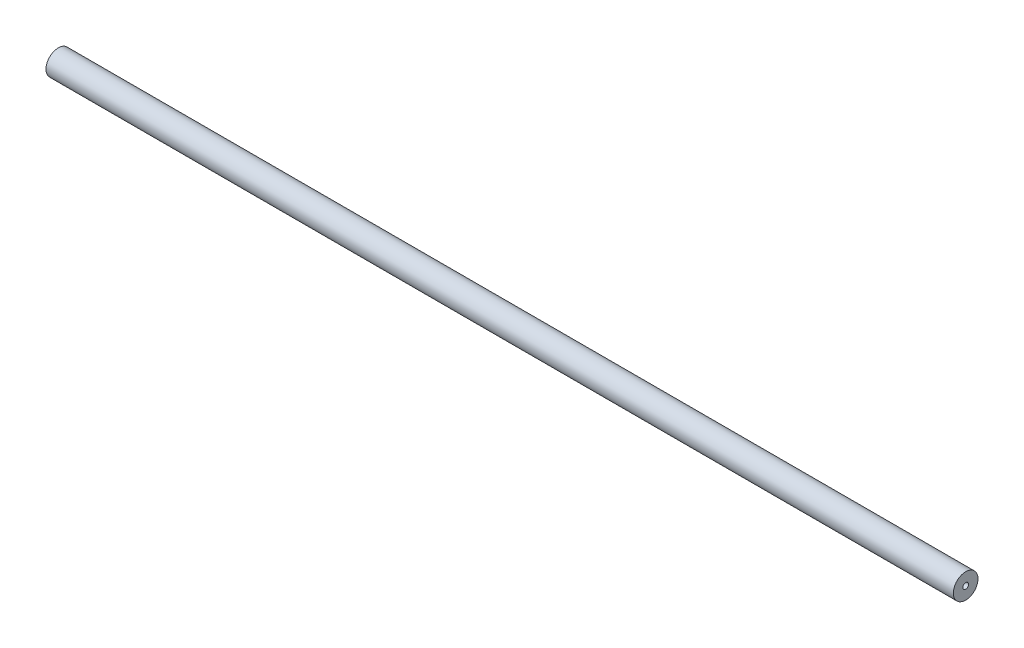
ISO-10303-21;
HEADER;
FILE_DESCRIPTION(('STEP AP214'),'2;1');
FILE_NAME('part.step','',(''),(''),'','','');
FILE_SCHEMA(('AUTOMOTIVE_DESIGN { 1 0 10303 214 1 1 1 1 }'));
ENDSEC;
DATA;
#1=APPLICATION_CONTEXT('core data for automotive mechanical design processes');
#2=APPLICATION_PROTOCOL_DEFINITION('international standard','automotive_design',2000,#1);
#3=PRODUCT_CONTEXT('',#1,'mechanical');
#4=PRODUCT('Part','Part','',(#3));
#5=PRODUCT_RELATED_PRODUCT_CATEGORY('part','',(#4));
#6=PRODUCT_DEFINITION_FORMATION('','',#4);
#7=PRODUCT_DEFINITION_CONTEXT('part definition',#1,'design');
#8=PRODUCT_DEFINITION('design','',#6,#7);
#9=PRODUCT_DEFINITION_SHAPE('','',#8);
#10=(LENGTH_UNIT() NAMED_UNIT(*) SI_UNIT(.MILLI.,.METRE.));
#11=(NAMED_UNIT(*) PLANE_ANGLE_UNIT() SI_UNIT($,.RADIAN.));
#12=(NAMED_UNIT(*) SI_UNIT($,.STERADIAN.) SOLID_ANGLE_UNIT());
#13=UNCERTAINTY_MEASURE_WITH_UNIT(LENGTH_MEASURE(1.E-05),#10,'distance_accuracy_value','');
#14=(GEOMETRIC_REPRESENTATION_CONTEXT(3) GLOBAL_UNCERTAINTY_ASSIGNED_CONTEXT((#13)) GLOBAL_UNIT_ASSIGNED_CONTEXT((#10,
#11,#12)) REPRESENTATION_CONTEXT('',''));
#15=CARTESIAN_POINT('',(0.,0.,0.));
#16=DIRECTION('',(0.,0.,1.));
#17=DIRECTION('',(1.,0.,0.));
#18=AXIS2_PLACEMENT_3D('',#15,#16,#17);
#19=CARTESIAN_POINT('',(312.825,-477.927261815858,28.0577058909787));
#20=DIRECTION('',(-1.,0.,0.));
#21=DIRECTION('',(0.,-1.,0.));
#22=AXIS2_PLACEMENT_3D('',#19,#20,#21);
#23=PLANE('',#22);
#24=CARTESIAN_POINT('',(312.825,-477.927261815858,28.0577058909787));
#25=DIRECTION('',(1.,0.,0.));
#26=DIRECTION('',(0.,1.,0.));
#27=AXIS2_PLACEMENT_3D('',#24,#25,#26);
#28=CIRCLE('',#27,8.5);
#29=CARTESIAN_POINT('',(312.825,-469.427261815858,28.0577058909787));
#30=VERTEX_POINT('',#29);
#31=EDGE_CURVE('E59',#30,#30,#28,.T.);
#32=ORIENTED_EDGE('',*,*,#31,.T.);
#33=EDGE_LOOP('',(#32));
#34=FACE_BOUND('',#33,.T.);
#35=CARTESIAN_POINT('',(312.825,-477.927261815858,28.0577058909787));
#36=DIRECTION('',(-1.,0.,0.));
#37=DIRECTION('',(0.,-1.,0.));
#38=AXIS2_PLACEMENT_3D('',#35,#36,#37);
#39=CIRCLE('',#38,2.);
#40=CARTESIAN_POINT('',(312.825,-479.927261815858,28.0577058909787));
#41=VERTEX_POINT('',#40);
#42=EDGE_CURVE('E10',#41,#41,#39,.T.);
#43=ORIENTED_EDGE('',*,*,#42,.T.);
#44=EDGE_LOOP('',(#43));
#45=FACE_BOUND('',#44,.T.);
#46=ADVANCED_FACE('F43',(#34,#45),#23,.F.);
#47=CARTESIAN_POINT('',(312.825,-477.927261815858,28.0577058909787));
#48=DIRECTION('',(-1.,0.,0.));
#49=DIRECTION('',(0.,-1.,0.));
#50=AXIS2_PLACEMENT_3D('',#47,#48,#49);
#51=CYLINDRICAL_SURFACE('',#50,2.);
#52=ORIENTED_EDGE('',*,*,#42,.F.);
#53=EDGE_LOOP('',(#52));
#54=FACE_BOUND('',#53,.T.);
#55=CARTESIAN_POINT('',(-312.825,-477.927261815858,28.0577058909787));
#56=DIRECTION('',(1.,0.,0.));
#57=DIRECTION('',(0.,1.,0.));
#58=AXIS2_PLACEMENT_3D('',#55,#56,#57);
#59=CIRCLE('',#58,2.);
#60=CARTESIAN_POINT('',(-312.825,-475.927261815858,28.0577058909787));
#61=VERTEX_POINT('',#60);
#62=EDGE_CURVE('E50',#61,#61,#59,.T.);
#63=ORIENTED_EDGE('',*,*,#62,.F.);
#64=EDGE_LOOP('',(#63));
#65=FACE_BOUND('',#64,.T.);
#66=ADVANCED_FACE('F74',(#54,#65),#51,.F.);
#67=CARTESIAN_POINT('',(-312.825,-477.927261815858,28.0577058909787));
#68=DIRECTION('',(1.,0.,0.));
#69=DIRECTION('',(0.,-1.,0.));
#70=AXIS2_PLACEMENT_3D('',#67,#68,#69);
#71=PLANE('',#70);
#72=ORIENTED_EDGE('',*,*,#62,.T.);
#73=EDGE_LOOP('',(#72));
#74=FACE_BOUND('',#73,.T.);
#75=CARTESIAN_POINT('',(-312.825,-477.927261815858,28.0577058909787));
#76=DIRECTION('',(1.,0.,0.));
#77=DIRECTION('',(0.,1.,0.));
#78=AXIS2_PLACEMENT_3D('',#75,#76,#77);
#79=CIRCLE('',#78,8.5);
#80=CARTESIAN_POINT('',(-312.825,-469.427261815858,28.0577058909787));
#81=VERTEX_POINT('',#80);
#82=EDGE_CURVE('E55',#81,#81,#79,.F.);
#83=ORIENTED_EDGE('',*,*,#82,.T.);
#84=EDGE_LOOP('',(#83));
#85=FACE_BOUND('',#84,.T.);
#86=ADVANCED_FACE('F68',(#74,#85),#71,.F.);
#87=CARTESIAN_POINT('',(-336.866630560343,-477.927261815858,28.0577058909787));
#88=DIRECTION('',(1.,0.,0.));
#89=DIRECTION('',(0.,1.,0.));
#90=AXIS2_PLACEMENT_3D('',#87,#88,#89);
#91=CYLINDRICAL_SURFACE('',#90,8.5);
#92=ORIENTED_EDGE('',*,*,#82,.F.);
#93=EDGE_LOOP('',(#92));
#94=FACE_BOUND('',#93,.T.);
#95=ORIENTED_EDGE('',*,*,#31,.F.);
#96=EDGE_LOOP('',(#95));
#97=FACE_BOUND('',#96,.T.);
#98=ADVANCED_FACE('F66',(#94,#97),#91,.T.);
#99=CLOSED_SHELL('',(#46,#66,#86,#98));
#100=MANIFOLD_SOLID_BREP('B2',#99);
#101=ADVANCED_BREP_SHAPE_REPRESENTATION('',(#18,#100),#14);
#102=SHAPE_DEFINITION_REPRESENTATION(#9,#101);
ENDSEC;
END-ISO-10303-21;
